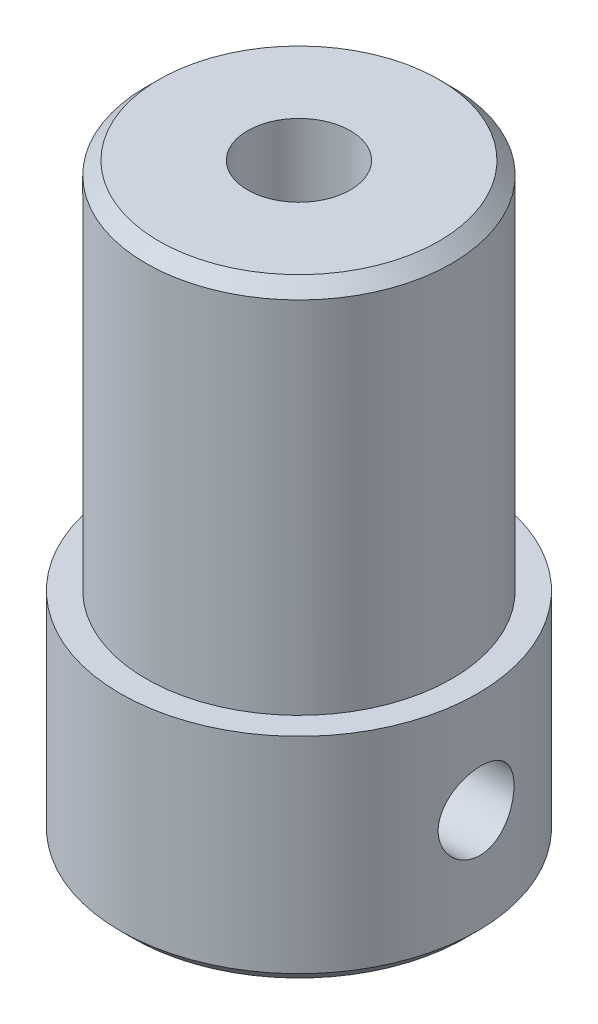
ISO-10303-21;
HEADER;
FILE_DESCRIPTION(('STEP AP214'),'2;1');
FILE_NAME('part.step','',(''),(''),'','','');
FILE_SCHEMA(('AUTOMOTIVE_DESIGN { 1 0 10303 214 1 1 1 1 }'));
ENDSEC;
DATA;
#1=APPLICATION_CONTEXT('core data for automotive mechanical design processes');
#2=APPLICATION_PROTOCOL_DEFINITION('international standard','automotive_design',2000,#1);
#3=PRODUCT_CONTEXT('',#1,'mechanical');
#4=PRODUCT('Part','Part','',(#3));
#5=PRODUCT_RELATED_PRODUCT_CATEGORY('part','',(#4));
#6=PRODUCT_DEFINITION_FORMATION('','',#4);
#7=PRODUCT_DEFINITION_CONTEXT('part definition',#1,'design');
#8=PRODUCT_DEFINITION('design','',#6,#7);
#9=PRODUCT_DEFINITION_SHAPE('','',#8);
#10=(LENGTH_UNIT() NAMED_UNIT(*) SI_UNIT(.MILLI.,.METRE.));
#11=(NAMED_UNIT(*) PLANE_ANGLE_UNIT() SI_UNIT($,.RADIAN.));
#12=(NAMED_UNIT(*) SI_UNIT($,.STERADIAN.) SOLID_ANGLE_UNIT());
#13=UNCERTAINTY_MEASURE_WITH_UNIT(LENGTH_MEASURE(1.E-05),#10,'distance_accuracy_value','');
#14=(GEOMETRIC_REPRESENTATION_CONTEXT(3) GLOBAL_UNCERTAINTY_ASSIGNED_CONTEXT((#13)) GLOBAL_UNIT_ASSIGNED_CONTEXT((#10,
#11,#12)) REPRESENTATION_CONTEXT('',''));
#15=CARTESIAN_POINT('',(0.,0.,0.));
#16=DIRECTION('',(0.,0.,1.));
#17=DIRECTION('',(1.,0.,0.));
#18=AXIS2_PLACEMENT_3D('',#15,#16,#17);
#19=CARTESIAN_POINT('',(0.,-8.49999999999988,0.));
#20=DIRECTION('',(0.,1.,0.));
#21=DIRECTION('',(-1.,0.,0.));
#22=AXIS2_PLACEMENT_3D('',#19,#20,#21);
#23=CONICAL_SURFACE('',#22,6.45000000000001,0.785398163397403);
#24=CARTESIAN_POINT('',(0.,-8.,0.));
#25=DIRECTION('',(0.,1.,0.));
#26=DIRECTION('',(-0.0158594986178011,0.,-0.99987423024278));
#27=AXIS2_PLACEMENT_3D('',#24,#25,#26);
#28=CIRCLE('',#27,6.94999999999968);
#29=CARTESIAN_POINT('',(-0.1102235153937,-8.,-6.949125900187));
#30=VERTEX_POINT('',#29);
#31=EDGE_CURVE('E31',#30,#30,#28,.F.);
#32=ORIENTED_EDGE('',*,*,#31,.T.);
#33=EDGE_LOOP('',(#32));
#34=FACE_BOUND('',#33,.T.);
#35=CARTESIAN_POINT('',(0.,-8.49999999999988,0.));
#36=DIRECTION('',(0.,1.,0.));
#37=DIRECTION('',(-1.,0.,0.));
#38=AXIS2_PLACEMENT_3D('',#35,#36,#37);
#39=CIRCLE('',#38,6.45000000000001);
#40=CARTESIAN_POINT('',(-6.45,-8.49999999999988,0.));
#41=VERTEX_POINT('',#40);
#42=EDGE_CURVE('E85',#41,#41,#39,.T.);
#43=ORIENTED_EDGE('',*,*,#42,.T.);
#44=EDGE_LOOP('',(#43));
#45=FACE_BOUND('',#44,.T.);
#46=ADVANCED_FACE('F15',(#34,#45),#23,.T.);
#47=CARTESIAN_POINT('',(0.,-8.,0.));
#48=DIRECTION('',(0.,1.,0.));
#49=DIRECTION('',(-1.,0.,0.));
#50=AXIS2_PLACEMENT_3D('',#47,#48,#49);
#51=CYLINDRICAL_SURFACE('',#50,6.94999999999968);
#52=CARTESIAN_POINT('',(0.,0.,0.));
#53=DIRECTION('',(0.,1.,0.));
#54=DIRECTION('',(-1.,0.,0.));
#55=AXIS2_PLACEMENT_3D('',#52,#53,#54);
#56=CIRCLE('',#55,6.94999999999968);
#57=CARTESIAN_POINT('',(-6.94999999999967,0.,0.));
#58=VERTEX_POINT('',#57);
#59=EDGE_CURVE('E19',#58,#58,#56,.F.);
#60=ORIENTED_EDGE('',*,*,#59,.T.);
#61=EDGE_LOOP('',(#60));
#62=FACE_BOUND('',#61,.T.);
#63=CARTESIAN_POINT('',(-0.11022351539376,-2.5,-6.949125900187));
#64=CARTESIAN_POINT('',(-0.193344863412011,-2.50000406894324,-6.94780537089057));
#65=CARTESIAN_POINT('',(-0.276543952114574,-2.50694091534223,-6.94497936210981));
#66=CARTESIAN_POINT('',(-0.440603748723627,-2.53449753954052,-6.93650828429143));
#67=CARTESIAN_POINT('',(-0.5214595719617,-2.55514401606639,-6.93085771991047));
#68=CARTESIAN_POINT('',(-0.678341484584678,-2.6094460870512,-6.91726408196757));
#69=CARTESIAN_POINT('',(-0.754374642144963,-2.64308210570557,-6.90932446265237));
#70=CARTESIAN_POINT('',(-0.899664608869432,-2.72235587911955,-6.89191295110932));
#71=CARTESIAN_POINT('',(-0.968923503806036,-2.76798992366668,-6.88244153291555));
#72=CARTESIAN_POINT('',(-1.09983136209104,-2.87073064908327,-6.8627486923427));
#73=CARTESIAN_POINT('',(-1.16135891042388,-2.92799038958982,-6.85251856048126));
#74=CARTESIAN_POINT('',(-1.27402119852419,-3.05203114867596,-6.83247043228073));
#75=CARTESIAN_POINT('',(-1.32515447142077,-3.11881350885629,-6.82265249426657));
#76=CARTESIAN_POINT('',(-1.41610998872586,-3.2608855619712,-6.80436000173828));
#77=CARTESIAN_POINT('',(-1.45580519793212,-3.33625872470874,-6.79590096463733));
#78=CARTESIAN_POINT('',(-1.5219541445234,-3.49282363248467,-6.78139439586882));
#79=CARTESIAN_POINT('',(-1.54840953022773,-3.57401465177744,-6.77534656403233));
#80=CARTESIAN_POINT('',(-1.58694123238496,-3.73860786093754,-6.76642494368967));
#81=CARTESIAN_POINT('',(-1.5992295182203,-3.82195784806193,-6.76350441279603));
#82=CARTESIAN_POINT('',(-1.60974090955197,-3.98958513793317,-6.76101069209348));
#83=CARTESIAN_POINT('',(-1.60796567640586,-4.07386232997248,-6.76143710690173));
#84=CARTESIAN_POINT('',(-1.59057056440413,-4.23937377755637,-6.7655494786414));
#85=CARTESIAN_POINT('',(-1.57519645919818,-4.32063549057909,-6.76917756870346));
#86=CARTESIAN_POINT('',(-1.5314244453998,-4.4793896866241,-6.77921372197776));
#87=CARTESIAN_POINT('',(-1.50302572831774,-4.55688193533037,-6.78562195776341));
#88=CARTESIAN_POINT('',(-1.43377461105617,-4.70659529231971,-6.80059178048607));
#89=CARTESIAN_POINT('',(-1.39282677185603,-4.77877055593394,-6.809169778484));
#90=CARTESIAN_POINT('',(-1.29969943955777,-4.91528974334028,-6.82755646379745));
#91=CARTESIAN_POINT('',(-1.24751925742982,-4.97963318632285,-6.83736522659683));
#92=CARTESIAN_POINT('',(-1.13210221140515,-5.10007797657099,-6.85742950832469));
#93=CARTESIAN_POINT('',(-1.06865739978778,-5.15597938180106,-6.8676900784514));
#94=CARTESIAN_POINT('',(-0.933146962914459,-5.25637871380692,-6.8874100406358));
#95=CARTESIAN_POINT('',(-0.861077600818949,-5.30087167110811,-6.89686908235381));
#96=CARTESIAN_POINT('',(-0.710092858549023,-5.37723624275188,-6.91404773829731));
#97=CARTESIAN_POINT('',(-0.631158824951641,-5.40907206941644,-6.92176239416666));
#98=CARTESIAN_POINT('',(-0.468951708838437,-5.4588921443798,-6.93463529603917));
#99=CARTESIAN_POINT('',(-0.385688108132887,-5.47690540435105,-6.93979888821173));
#100=CARTESIAN_POINT('',(-0.269836208689717,-5.49182321271992,-6.94483310706281));
#101=CARTESIAN_POINT('',(-0.238003628714997,-5.49488678240065,-6.945996908903));
#102=CARTESIAN_POINT('',(-0.174194733306444,-5.49897596086486,-6.94788996663874));
#103=CARTESIAN_POINT('',(-0.142218417630072,-5.50000156620821,-6.94861922180076));
#104=CARTESIAN_POINT('',(-0.0271021007557265,-5.49999593105676,-6.95044222939219));
#105=CARTESIAN_POINT('',(0.056144761753114,-5.49305908465776,-6.950256301987));
#106=CARTESIAN_POINT('',(0.220390688809527,-5.46550246045944,-6.94699264327515));
#107=CARTESIAN_POINT('',(0.301385045430761,-5.44485598393356,-6.94390926447227));
#108=CARTESIAN_POINT('',(0.458619161351971,-5.39055391294874,-6.93529797587876));
#109=CARTESIAN_POINT('',(0.534865875720237,-5.35691789429437,-6.92977374276447));
#110=CARTESIAN_POINT('',(0.680634960932658,-5.27764412088037,-6.91697886248591));
#111=CARTESIAN_POINT('',(0.750159401465996,-5.23201007633322,-6.90970875526754));
#112=CARTESIAN_POINT('',(0.881625965489407,-5.12926935091662,-6.89417756489238));
#113=CARTESIAN_POINT('',(0.943447011262735,-5.07200961041007,-6.88590392595631));
#114=CARTESIAN_POINT('',(1.05668845143789,-4.94796885132391,-6.86943896827661));
#115=CARTESIAN_POINT('',(1.10810737785697,-4.88118649114358,-6.86124766130675));
#116=CARTESIAN_POINT('',(1.19959728677208,-4.73911443802865,-6.84584902572311));
#117=CARTESIAN_POINT('',(1.23954080583569,-4.66374127529111,-6.83865317779407));
#118=CARTESIAN_POINT('',(1.30611655231559,-4.50717636751518,-6.82625182088386));
#119=CARTESIAN_POINT('',(1.33275043674184,-4.4259853482224,-6.82104606416122));
#120=CARTESIAN_POINT('',(1.37154570488679,-4.26139213906229,-6.81335096505647));
#121=CARTESIAN_POINT('',(1.38392043379247,-4.1780421519379,-6.81082162641117));
#122=CARTESIAN_POINT('',(1.39450562576801,-4.01041486206667,-6.80866252902793));
#123=CARTESIAN_POINT('',(1.39271776189926,-3.92613767002736,-6.80903242779599));
#124=CARTESIAN_POINT('',(1.37520097656086,-3.76062622244347,-6.81259104470244));
#125=CARTESIAN_POINT('',(1.3597195403533,-3.67936450942075,-6.8157297197945));
#126=CARTESIAN_POINT('',(1.31565124927149,-3.52061031337575,-6.82437259464268));
#127=CARTESIAN_POINT('',(1.28706358084115,-3.44311806466948,-6.82987694124414));
#128=CARTESIAN_POINT('',(1.21737253212697,-3.29340470768015,-6.84264293370236));
#129=CARTESIAN_POINT('',(1.17617324035592,-3.22122944406592,-6.84991795551519));
#130=CARTESIAN_POINT('',(1.08250962164855,-3.08471025665959,-6.86534185737079));
#131=CARTESIAN_POINT('',(1.03004460363506,-3.02036681367703,-6.87349079100686));
#132=CARTESIAN_POINT('',(0.914049279000054,-2.8999220234289,-6.88988452691845));
#133=CARTESIAN_POINT('',(0.850310969066665,-2.84402061819884,-6.89812778278759));
#134=CARTESIAN_POINT('',(0.714243281607942,-2.74362128619299,-6.91354011031434));
#135=CARTESIAN_POINT('',(0.641910180233891,-2.69912832889181,-6.92070871329463));
#136=CARTESIAN_POINT('',(0.490456569235176,-2.62276375724806,-6.93309024525937));
#137=CARTESIAN_POINT('',(0.411317572825407,-2.5909279305835,-6.93829762678851));
#138=CARTESIAN_POINT('',(0.248783790393891,-2.54110785562017,-6.94601965300502));
#139=CARTESIAN_POINT('',(0.165398311858813,-2.52309459564892,-6.94853994188809));
#140=CARTESIAN_POINT('',(0.0494450311208052,-2.50817678728007,-6.94989738437721));
#141=CARTESIAN_POINT('',(0.0175915544578941,-2.50511321759935,-6.95005103024311));
#142=CARTESIAN_POINT('',(-0.0462452803932069,-2.50102403913515,-6.94991943605624));
#143=CARTESIAN_POINT('',(-0.0782286388005489,-2.4999984337918,-6.94963419526263));
#144=CARTESIAN_POINT('',(-0.11022351539376,-2.5,-6.949125900187));
#145=B_SPLINE_CURVE_WITH_KNOTS('',3,(#63,#64,#65,#66,#67,#68,#69,#70,#71,#72,#73,#74,#75,#76,
#77,#78,#79,#80,#81,#82,#83,#84,#85,#86,#87,#88,#89,#90,#91,#92,#93,#94,#95,#96,#97,#98,#99,
#100,#101,#102,#103,#104,#105,#106,#107,#108,#109,#110,#111,#112,#113,#114,#115,#116,#117,#118,
#119,#120,#121,#122,#123,#124,#125,#126,#127,#128,#129,#130,#131,#132,#133,#134,#135,#136,#137,
#138,#139,#140,#141,#142,#143,#144),.UNSPECIFIED.,.T.,.F.,(4,2,2,2,2,2,2,2,2,2,2,2,2,2,2,2,2,2,
2,2,2,2,2,2,2,2,2,2,2,2,2,2,2,2,2,2,2,2,2,2,4),(0.,0.249273069524613,0.499033013530775,
0.74841801814209,0.997725994639765,1.25055822153284,1.50342610412463,1.75900279059798,
2.01454765060119,2.26621726816714,2.51785715583488,2.76503999115932,3.01223817218584,
3.26136507676066,3.51050726797799,3.76484687400898,4.01929708186854,4.27446170932818,
4.5290893051779,4.62503875528776,4.7209883673623,4.97026143688692,5.22002138089308,
5.4694063855044,5.71871436200208,5.97154658889515,6.22441447148694,6.47999115796029,
6.73553601796351,6.98720563552945,7.23884552319719,7.48602835852163,7.73322653954815,
7.98235344412297,8.2314956353403,8.48583524137129,8.74028544923085,8.99545007669049,
9.25007767254021,9.34602712264991,9.44197673472429),.UNSPECIFIED.);
#146=CARTESIAN_POINT('',(-0.11022351539376,-2.5,-6.949125900187));
#147=VERTEX_POINT('',#146);
#148=EDGE_CURVE('E80',#147,#147,#145,.T.);
#149=ORIENTED_EDGE('',*,*,#148,.T.);
#150=EDGE_LOOP('',(#149));
#151=FACE_BOUND('',#150,.T.);
#152=CARTESIAN_POINT('',(6.949125900239,-5.5,-0.110223512116245));
#153=CARTESIAN_POINT('',(6.95044222940513,-5.49999593087506,-0.0271020974672325));
#154=CARTESIAN_POINT('',(6.95025630196025,-5.49305908429256,0.0561447650356749));
#155=CARTESIAN_POINT('',(6.94699264317218,-5.46550245972996,0.220390692047466));
#156=CARTESIAN_POINT('',(6.94390926433283,-5.44485598302355,0.301385048629993));
#157=CARTESIAN_POINT('',(6.93529797567372,-5.39055391168642,0.45861916444393));
#158=CARTESIAN_POINT('',(6.92977374253028,-5.35691789286021,0.534865878743657));
#159=CARTESIAN_POINT('',(6.91697886220372,-5.27764411911527,0.680634963791934));
#160=CARTESIAN_POINT('',(6.90970875496651,-5.23201007440894,0.750159404229645));
#161=CARTESIAN_POINT('',(6.89417756456553,-5.1292693486865,0.881625968037441));
#162=CARTESIAN_POINT('',(6.88590392562265,-5.07200960803317,0.943447013690155));
#163=CARTESIAN_POINT('',(6.86943896794291,-4.94796884867323,1.05668845360024));
#164=CARTESIAN_POINT('',(6.86124766097982,-4.8811864883659,1.10810737987487));
#165=CARTESIAN_POINT('',(6.84584902542428,-4.7391144350306,1.19959728847111));
#166=CARTESIAN_POINT('',(6.83865317751654,-4.66374127220117,1.23954080736195));
#167=CARTESIAN_POINT('',(6.8262518206597,-4.50717636427171,1.3061165534825));
#168=CARTESIAN_POINT('',(6.82104606396911,-4.4259853449173,1.33275043772221));
#169=CARTESIAN_POINT('',(6.81335096493533,-4.26139213567932,1.37154570548585));
#170=CARTESIAN_POINT('',(6.81082162632847,-4.17804214853866,1.38392043419879));
#171=CARTESIAN_POINT('',(6.80866252902309,-4.01041485866874,1.39450562579092));
#172=CARTESIAN_POINT('',(6.80903242783057,-3.92613766664702,1.39271776173149));
#173=CARTESIAN_POINT('',(6.81259104481136,-3.7606262191211,1.37520097602254));
#174=CARTESIAN_POINT('',(6.8157297199387,-3.67936450613837,1.35971953963347));
#175=CARTESIAN_POINT('',(6.82437259484999,-3.52061031020257,1.31565124819926));
#176=CARTESIAN_POINT('',(6.82987694147927,-3.44311806156553,1.28706357959801));
#177=CARTESIAN_POINT('',(6.84264293398396,-3.29340470472771,1.21737253054925));
#178=CARTESIAN_POINT('',(6.84991795581567,-3.22122944119705,1.17617323861241));
#179=CARTESIAN_POINT('',(6.8653418576968,-3.08471025398399,1.08250961958799));
#180=CARTESIAN_POINT('',(6.87349079133952,-3.02036681111112,1.03004460142324));
#181=CARTESIAN_POINT('',(6.88988452725102,-2.89992202111037,0.914049276502441));
#182=CARTESIAN_POINT('',(6.89812778311316,-2.84402061601822,0.850310966435201));
#183=CARTESIAN_POINT('',(6.91354011061271,-2.7436212843096,0.714243278731518));
#184=CARTESIAN_POINT('',(6.92070871357278,-2.69912832716779,0.641910177246337));
#185=CARTESIAN_POINT('',(6.93309024548445,-2.62276375586868,0.490456566066297));
#186=CARTESIAN_POINT('',(6.93829762698106,-2.59092792938714,0.411317569587606));
#187=CARTESIAN_POINT('',(6.9460196531253,-2.54110785479895,0.248783787052097));
#188=CARTESIAN_POINT('',(6.94853994196869,-2.52309459501956,0.165398308481965));
#189=CARTESIAN_POINT('',(6.94989738439484,-2.50817678698876,0.0494450282836722));
#190=CARTESIAN_POINT('',(6.95005103024627,-2.50511321741714,0.0175915521839049));
#191=CARTESIAN_POINT('',(6.94991943604606,-2.50102403909862,-0.046245281533845));
#192=CARTESIAN_POINT('',(6.94963419525357,-2.49999843379184,-0.0782286393709794));
#193=CARTESIAN_POINT('',(6.94780537089062,-2.5000040689432,-0.193344863410474));
#194=CARTESIAN_POINT('',(6.94497936210989,-2.50694091534207,-0.276543952112693));
#195=CARTESIAN_POINT('',(6.93650828429155,-2.53449753954011,-0.440603748722163));
#196=CARTESIAN_POINT('',(6.93085771991055,-2.55514401606611,-0.521459571960944));
#197=CARTESIAN_POINT('',(6.91726408196756,-2.60944608705125,-0.678341484584818));
#198=CARTESIAN_POINT('',(6.90932446265234,-2.64308210570572,-0.754374642145325));
#199=CARTESIAN_POINT('',(6.89191295110929,-2.72235587911976,-0.899664608869786));
#200=CARTESIAN_POINT('',(6.88244153291554,-2.76798992366679,-0.968923503806196));
#201=CARTESIAN_POINT('',(6.86274869234272,-2.87073064908322,-1.09983136209099));
#202=CARTESIAN_POINT('',(6.85251856048128,-2.92799038958973,-1.16135891042381));
#203=CARTESIAN_POINT('',(6.83247043228075,-3.05203114867586,-1.27402119852413));
#204=CARTESIAN_POINT('',(6.82265249426658,-3.11881350885622,-1.32515447142074));
#205=CARTESIAN_POINT('',(6.80436000173829,-3.26088556197118,-1.41610998872587));
#206=CARTESIAN_POINT('',(6.79590096463734,-3.33625872470872,-1.45580519793213));
#207=CARTESIAN_POINT('',(6.78139439586883,-3.49282363248465,-1.52195414452341));
#208=CARTESIAN_POINT('',(6.77534656403234,-3.57401465177741,-1.54840953022774));
#209=CARTESIAN_POINT('',(6.76642494368968,-3.73860786093751,-1.58694123238497));
#210=CARTESIAN_POINT('',(6.76350441279603,-3.82195784806189,-1.59922951822031));
#211=CARTESIAN_POINT('',(6.76101069209349,-3.98958513793313,-1.60974090955199));
#212=CARTESIAN_POINT('',(6.76143710690174,-4.07386232997244,-1.60796567640588));
#213=CARTESIAN_POINT('',(6.7655494786414,-4.23937377755635,-1.59057056440416));
#214=CARTESIAN_POINT('',(6.76917756870346,-4.32063549057907,-1.5751964591982));
#215=CARTESIAN_POINT('',(6.77921372197777,-4.47938968662408,-1.53142444539983));
#216=CARTESIAN_POINT('',(6.78562195776342,-4.55688193533034,-1.50302572831777));
#217=CARTESIAN_POINT('',(6.80059178048607,-4.70659529231964,-1.43377461105623));
#218=CARTESIAN_POINT('',(6.809169778484,-4.77877055593383,-1.39282677185611));
#219=CARTESIAN_POINT('',(6.82755646379744,-4.91528974334018,-1.29969943955787));
#220=CARTESIAN_POINT('',(6.83736522659683,-4.97963318632279,-1.24751925742989));
#221=CARTESIAN_POINT('',(6.85742950832473,-5.10007797657111,-1.13210221140505));
#222=CARTESIAN_POINT('',(6.86769007845146,-5.15597938180131,-1.06865739978751));
#223=CARTESIAN_POINT('',(6.88741004063585,-5.25637871380711,-0.933146962914168));
#224=CARTESIAN_POINT('',(6.89686908235384,-5.30087167110817,-0.861077600818862));
#225=CARTESIAN_POINT('',(6.91404773829724,-5.37723624275149,-0.710092858549768));
#226=CARTESIAN_POINT('',(6.92176239416652,-5.40907206941583,-0.631158824953064));
#227=CARTESIAN_POINT('',(6.93463529603906,-5.4588921443794,-0.468951708840306));
#228=CARTESIAN_POINT('',(6.93979888821166,-5.47690540435082,-0.385688108134435));
#229=CARTESIAN_POINT('',(6.94483310708636,-5.49182321278966,-0.269836208148189));
#230=CARTESIAN_POINT('',(6.94599690894279,-5.49488678250537,-0.238003627627452));
#231=CARTESIAN_POINT('',(6.94788996669598,-5.49897596096968,-0.17419473112429));
#232=CARTESIAN_POINT('',(6.9486192218592,-5.50000156627816,-0.142218414899326));
#233=CARTESIAN_POINT('',(6.949125900239,-5.5,-0.110223512116245));
#234=B_SPLINE_CURVE_WITH_KNOTS('',3,(#152,#153,#154,#155,#156,#157,#158,#159,#160,#161,#162,
#163,#164,#165,#166,#167,#168,#169,#170,#171,#172,#173,#174,#175,#176,#177,#178,#179,#180,#181,
#182,#183,#184,#185,#186,#187,#188,#189,#190,#191,#192,#193,#194,#195,#196,#197,#198,#199,#200,
#201,#202,#203,#204,#205,#206,#207,#208,#209,#210,#211,#212,#213,#214,#215,#216,#217,#218,#219,
#220,#221,#222,#223,#224,#225,#226,#227,#228,#229,#230,#231,#232,#233),.UNSPECIFIED.,.T.,.F.,(4,
2,2,2,2,2,2,2,2,2,2,2,2,2,2,2,2,2,2,2,2,2,2,2,2,2,2,2,2,2,2,2,2,2,2,2,2,2,2,2,4),(0.,
0.249273069553921,0.499033013584963,0.748418018222066,0.997725994746672,1.25055822167492,
1.50342610430136,1.75900279076993,2.01454765076814,2.26621726829439,2.51785715592268,
2.76503999123562,3.01223817225094,3.26136507685925,3.51050726810981,3.76484687416727,
4.01929708205421,4.27446170949515,4.52908930532115,4.62503875372093,4.7209883640854,
4.97026143360749,5.22002137761617,5.46940638222811,5.71871435872516,5.97154658561809,
6.22441446821002,6.4799911546834,6.73553601468659,6.98720563225253,7.23884551992027,
7.48602835524473,7.73322653627123,7.98235344084592,8.23149563206338,8.485835238095,
8.74028544595393,8.99545007341107,9.2500776692633,9.34602712101126,9.44197673472387),.UNSPECIFIED.);
#235=CARTESIAN_POINT('',(6.949125900239,-5.5,-0.110223512116245));
#236=VERTEX_POINT('',#235);
#237=EDGE_CURVE('E87',#236,#236,#234,.T.);
#238=ORIENTED_EDGE('',*,*,#237,.T.);
#239=EDGE_LOOP('',(#238));
#240=FACE_BOUND('',#239,.T.);
#241=ORIENTED_EDGE('',*,*,#31,.F.);
#242=EDGE_LOOP('',(#241));
#243=FACE_BOUND('',#242,.T.);
#244=ADVANCED_FACE('F76',(#62,#151,#240,#243),#51,.T.);
#245=CARTESIAN_POINT('',(7.347675830225,0.,7.112364065628));
#246=DIRECTION('',(0.,1.,0.));
#247=DIRECTION('',(-0.0158594986178065,0.,-0.99987423024278));
#248=AXIS2_PLACEMENT_3D('',#245,#246,#247);
#249=PLANE('',#248);
#250=CARTESIAN_POINT('',(0.,0.,0.));
#251=DIRECTION('',(0.,1.,0.));
#252=DIRECTION('',(-1.,0.,0.));
#253=AXIS2_PLACEMENT_3D('',#250,#251,#252);
#254=CIRCLE('',#253,5.95000000000046);
#255=CARTESIAN_POINT('',(-5.95000000000045,0.,0.));
#256=VERTEX_POINT('',#255);
#257=EDGE_CURVE('E67',#256,#256,#254,.F.);
#258=ORIENTED_EDGE('',*,*,#257,.T.);
#259=EDGE_LOOP('',(#258));
#260=FACE_BOUND('',#259,.T.);
#261=ORIENTED_EDGE('',*,*,#59,.F.);
#262=EDGE_LOOP('',(#261));
#263=FACE_BOUND('',#262,.T.);
#264=ADVANCED_FACE('F74',(#260,#263),#249,.T.);
#265=CARTESIAN_POINT('',(-0.0407887025117825,-4.,-2.57155497215976));
#266=DIRECTION('',(-0.0158594986178224,0.,-0.99987423024278));
#267=DIRECTION('',(-0.99987423024278,0.,0.0158594986178224));
#268=AXIS2_PLACEMENT_3D('',#265,#266,#267);
#269=CYLINDRICAL_SURFACE('',#268,1.5);
#270=ORIENTED_EDGE('',*,*,#148,.F.);
#271=EDGE_LOOP('',(#270));
#272=FACE_BOUND('',#271,.T.);
#273=CARTESIAN_POINT('',(-0.0475784958534101,-2.5,-2.99962269072801));
#274=CARTESIAN_POINT('',(-0.126490396656045,-2.50000399837244,-2.99836751064046));
#275=CARTESIAN_POINT('',(-0.205396774560173,-2.50626048322756,-2.99397378889478));
#276=CARTESIAN_POINT('',(-0.360735790226982,-2.53099600982361,-2.97925766114288));
#277=CARTESIAN_POINT('',(-0.437165845199994,-2.5494874076762,-2.96892926306045));
#278=CARTESIAN_POINT('',(-0.585148409255485,-2.59778825665002,-2.94333541395925));
#279=CARTESIAN_POINT('',(-0.656717131598789,-2.62755766206366,-2.92808745929435));
#280=CARTESIAN_POINT('',(-0.793692063930682,-2.69734803399556,-2.89396657406898));
#281=CARTESIAN_POINT('',(-0.859097542985599,-2.7373702143603,-2.87509321435581));
#282=CARTESIAN_POINT('',(-0.986333925184387,-2.82927677511684,-2.83405717096601));
#283=CARTESIAN_POINT('',(-1.04771016178455,-2.88173171845194,-2.81176465174744));
#284=CARTESIAN_POINT('',(-1.16119771159273,-2.99578456512334,-2.76683069281136));
#285=CARTESIAN_POINT('',(-1.21330232052947,-3.05738902585496,-2.74418901336964));
#286=CARTESIAN_POINT('',(-1.31084810843581,-3.19372488213179,-2.69903437665053));
#287=CARTESIAN_POINT('',(-1.35545891057981,-3.26910384761736,-2.67666763570297));
#288=CARTESIAN_POINT('',(-1.43125248840662,-3.42755067520386,-2.63692244671894));
#289=CARTESIAN_POINT('',(-1.46244480364915,-3.51061302376909,-2.61954045782996));
#290=CARTESIAN_POINT('',(-1.50851632094408,-3.67699755460624,-2.59326986376322));
#291=CARTESIAN_POINT('',(-1.52426036596701,-3.76000646422329,-2.58393507258933));
#292=CARTESIAN_POINT('',(-1.54165041892752,-3.92796803773667,-2.57360223071127));
#293=CARTESIAN_POINT('',(-1.54331032244951,-4.01291870285828,-2.57259596300912));
#294=CARTESIAN_POINT('',(-1.53312022105468,-4.17142909280502,-2.5786737570504));
#295=CARTESIAN_POINT('',(-1.52286206338757,-4.24513615845644,-2.58480472550279));
#296=CARTESIAN_POINT('',(-1.49187663976436,-4.38958297144546,-2.60281038769386));
#297=CARTESIAN_POINT('',(-1.47114605474483,-4.46032177033686,-2.61468690233823));
#298=CARTESIAN_POINT('',(-1.41941169219567,-4.59884444525574,-2.64313356383173));
#299=CARTESIAN_POINT('',(-1.3881797607429,-4.66652103933378,-2.65980664378266));
#300=CARTESIAN_POINT('',(-1.31648458558036,-4.79595276552001,-2.69601175978509));
#301=CARTESIAN_POINT('',(-1.27601739173012,-4.85770534768807,-2.71554501791754));
#302=CARTESIAN_POINT('',(-1.18099798208051,-4.98177571339385,-2.75831220084567));
#303=CARTESIAN_POINT('',(-1.12531079517057,-5.04317374445976,-2.78170143021936));
#304=CARTESIAN_POINT('',(-1.00431621865948,-5.15609353675065,-2.82763799551998));
#305=CARTESIAN_POINT('',(-0.939002471719303,-5.20760871924094,-2.85018476265908));
#306=CARTESIAN_POINT('',(-0.79672258748044,-5.30155510122915,-2.89326974947318));
#307=CARTESIAN_POINT('',(-0.719353482674491,-5.3434466080834,-2.91366407327177));
#308=CARTESIAN_POINT('',(-0.557432041091997,-5.41317794944935,-2.94891376279891));
#309=CARTESIAN_POINT('',(-0.472893723573588,-5.44104450147164,-2.96377964597538));
#310=CARTESIAN_POINT('',(-0.330966475720255,-5.47403831650542,-2.98221039376218));
#311=CARTESIAN_POINT('',(-0.274881963072138,-5.48374945615665,-2.98791895879868));
#312=CARTESIAN_POINT('',(-0.161740813179917,-5.49673142554489,-2.99617333258765));
#313=CARTESIAN_POINT('',(-0.104684272832808,-5.50000289347791,-2.99871945474103));
#314=CARTESIAN_POINT('',(0.0313335165697421,-5.49999600162756,-3.00087083361644));
#315=CARTESIAN_POINT('',(0.110339547746262,-5.49373951677244,-2.99898183852317));
#316=CARTESIAN_POINT('',(0.266067142634811,-5.46900399017638,-2.98919969179702));
#317=CARTESIAN_POINT('',(0.342786314895179,-5.45051259232379,-2.98130046918903));
#318=CARTESIAN_POINT('',(0.491506145835229,-5.40221174334997,-2.96041276320163));
#319=CARTESIAN_POINT('',(0.563522454722695,-5.37244233793633,-2.9474422815783));
#320=CARTESIAN_POINT('',(0.701510626318011,-5.30265196600443,-2.91768272184246));
#321=CARTESIAN_POINT('',(0.767481772070465,-5.26262978563968,-2.90089319161156));
#322=CARTESIAN_POINT('',(0.895955606781057,-5.17072322488314,-2.86391309416874));
#323=CARTESIAN_POINT('',(0.958007975649544,-5.11826828154804,-2.84357833697525));
#324=CARTESIAN_POINT('',(1.07286351670634,-5.00421543487663,-2.80226624049388));
#325=CARTESIAN_POINT('',(1.12565999559879,-4.94261097414501,-2.78128844897638));
#326=CARTESIAN_POINT('',(1.22458879301314,-4.80627511786817,-2.73925019261799));
#327=CARTESIAN_POINT('',(1.26988651517628,-4.7308961523826,-2.71830953514558));
#328=CARTESIAN_POINT('',(1.34690248422578,-4.5724493247961,-2.68098813379821));
#329=CARTESIAN_POINT('',(1.37863037817116,-4.48938697623086,-2.66460415339916));
#330=CARTESIAN_POINT('',(1.42551189140897,-4.32300244539371,-2.63980793322333));
#331=CARTESIAN_POINT('',(1.44154406940735,-4.23999353577666,-2.6309771604048));
#332=CARTESIAN_POINT('',(1.45925308050931,-4.07203196226329,-2.62120104210371));
#333=CARTESIAN_POINT('',(1.46094406280933,-3.98708129714168,-2.6202479244553));
#334=CARTESIAN_POINT('',(1.45056633023212,-3.82857090719494,-2.62599948193143));
#335=CARTESIAN_POINT('',(1.4401188891913,-3.75486384154352,-2.63180202866422));
#336=CARTESIAN_POINT('',(1.40857800298521,-3.61041702855451,-2.64881593019747));
#337=CARTESIAN_POINT('',(1.38748118267612,-3.53967822966311,-2.66002899972351));
#338=CARTESIAN_POINT('',(1.33487065886789,-3.40115555474424,-2.68682059547884));
#339=CARTESIAN_POINT('',(1.30312565169369,-3.33347896066619,-2.70249476712621));
#340=CARTESIAN_POINT('',(1.23031829706042,-3.20404723447996,-2.73640785718953));
#341=CARTESIAN_POINT('',(1.18925196268967,-3.14229465231191,-2.75464787179293));
#342=CARTESIAN_POINT('',(1.09292399076,-3.01822428660613,-2.79437999946922));
#343=CARTESIAN_POINT('',(1.03652302754884,-2.95682625554022,-2.81599134337677));
#344=CARTESIAN_POINT('',(0.914132438510523,-2.84390646324933,-2.85806745645262));
#345=CARTESIAN_POINT('',(0.848136476581507,-2.79239128075904,-2.87853145549617));
#346=CARTESIAN_POINT('',(0.704561725168336,-2.69844489877083,-2.91708236086092));
#347=CARTESIAN_POINT('',(0.626584734547536,-2.65655339191658,-2.93501266357448));
#348=CARTESIAN_POINT('',(0.463626802940655,-2.58682205055064,-2.96510928103095));
#349=CARTESIAN_POINT('',(0.378659540599413,-2.55895549852835,-2.97728655255189));
#350=CARTESIAN_POINT('',(0.2362191575656,-2.52596168349458,-2.99120680500577));
#351=CARTESIAN_POINT('',(0.179981810899871,-2.51625054384335,-2.99513377759929));
#352=CARTESIAN_POINT('',(0.0666357888378434,-2.50326857445511,-2.9997957265793));
#353=CARTESIAN_POINT('',(0.00952720035028601,-2.49999710652209,-3.00053101928215));
#354=CARTESIAN_POINT('',(-0.0475784958534101,-2.5,-2.99962269072801));
#355=B_SPLINE_CURVE_WITH_KNOTS('',3,(#273,#274,#275,#276,#277,#278,#279,#280,#281,#282,#283,
#284,#285,#286,#287,#288,#289,#290,#291,#292,#293,#294,#295,#296,#297,#298,#299,#300,#301,#302,
#303,#304,#305,#306,#307,#308,#309,#310,#311,#312,#313,#314,#315,#316,#317,#318,#319,#320,#321,
#322,#323,#324,#325,#326,#327,#328,#329,#330,#331,#332,#333,#334,#335,#336,#337,#338,#339,#340,
#341,#342,#343,#344,#345,#346,#347,#348,#349,#350,#351,#352,#353,#354),.UNSPECIFIED.,.T.,.F.,(4,
2,2,2,2,2,2,2,2,2,2,2,2,2,2,2,2,2,2,2,2,2,2,2,2,2,2,2,2,2,2,2,2,2,2,2,2,2,2,2,4),(0.,
0.236541480428305,0.473322210873984,0.709269947937177,0.945245632244078,1.19547738368132,
1.44588934770067,1.71572535454867,1.98536920948833,2.2388698481445,2.49212035088586,
2.7150858455335,2.9381220497993,3.16635602724592,3.39468780934252,3.65195007713053,
3.90938300743742,4.17889584105611,4.4478932912926,4.61908679524577,4.79026333241598,
5.02680481284429,5.26358554328997,5.49953328035316,5.73550896466007,5.98574071609731,
6.23615268011667,6.50598868696467,6.77563254190434,7.0291331805605,7.28238368330186,
7.50534917794949,7.72838538221529,7.95661935966191,8.18495114175851,8.44221340954652,
8.69964633985341,8.9691591734721,9.23815662370859,9.40935012766174,9.58052666483191),.UNSPECIFIED.);
#356=CARTESIAN_POINT('',(-0.0475784958534101,-2.5,-2.99962269072801));
#357=VERTEX_POINT('',#356);
#358=EDGE_CURVE('E62',#357,#357,#355,.T.);
#359=ORIENTED_EDGE('',*,*,#358,.T.);
#360=EDGE_LOOP('',(#359));
#361=FACE_BOUND('',#360,.T.);
#362=ADVANCED_FACE('F69',(#272,#361),#269,.F.);
#363=CARTESIAN_POINT('',(6.819066132496,-8.5,6.60068319642));
#364=DIRECTION('',(0.,1.,0.));
#365=DIRECTION('',(-0.01585949861777,0.,-0.999874230242781));
#366=AXIS2_PLACEMENT_3D('',#363,#364,#365);
#367=PLANE('',#366);
#368=CARTESIAN_POINT('',(0.,-8.5,0.));
#369=DIRECTION('',(0.,-1.,0.));
#370=DIRECTION('',(1.,0.,0.));
#371=AXIS2_PLACEMENT_3D('',#368,#369,#370);
#372=CIRCLE('',#371,2.99999999999967);
#373=CARTESIAN_POINT('',(2.99999999999968,-8.5,0.));
#374=VERTEX_POINT('',#373);
#375=EDGE_CURVE('E47',#374,#374,#372,.F.);
#376=ORIENTED_EDGE('',*,*,#375,.T.);
#377=EDGE_LOOP('',(#376));
#378=FACE_BOUND('',#377,.T.);
#379=ORIENTED_EDGE('',*,*,#42,.F.);
#380=EDGE_LOOP('',(#379));
#381=FACE_BOUND('',#380,.T.);
#382=ADVANCED_FACE('F73',(#378,#381),#367,.F.);
#383=CARTESIAN_POINT('',(2.57156299298799,-4.,-0.0407888297341175));
#384=DIRECTION('',(0.99987423024278,0.,-0.0158594986178222));
#385=DIRECTION('',(-0.0158594986178222,0.,-0.99987423024278));
#386=AXIS2_PLACEMENT_3D('',#383,#384,#385);
#387=CYLINDRICAL_SURFACE('',#386,1.5);
#388=ORIENTED_EDGE('',*,*,#237,.F.);
#389=EDGE_LOOP('',(#388));
#390=FACE_BOUND('',#389,.T.);
#391=CARTESIAN_POINT('',(2.99962269072802,-5.5,-0.0475784958534308));
#392=CARTESIAN_POINT('',(3.00087083361645,-5.49999600162756,0.0313335165696925));
#393=CARTESIAN_POINT('',(2.99898183852318,-5.49373951677244,0.110339547746212));
#394=CARTESIAN_POINT('',(2.98919969179703,-5.46900399017639,0.266067142634761));
#395=CARTESIAN_POINT('',(2.98130046918904,-5.4505125923238,0.34278631489513));
#396=CARTESIAN_POINT('',(2.96041276320165,-5.40221174334998,0.491506145835179));
#397=CARTESIAN_POINT('',(2.94744228157832,-5.37244233793634,0.563522454722645));
#398=CARTESIAN_POINT('',(2.91768272184248,-5.30265196600444,0.701510626317962));
#399=CARTESIAN_POINT('',(2.90089319161158,-5.2626297856397,0.767481772070417));
#400=CARTESIAN_POINT('',(2.86391309416876,-5.17072322488316,0.89595560678101));
#401=CARTESIAN_POINT('',(2.84357833697527,-5.11826828154806,0.958007975649499));
#402=CARTESIAN_POINT('',(2.80226624049391,-5.00421543487665,1.07286351670629));
#403=CARTESIAN_POINT('',(2.7812884489764,-4.94261097414504,1.12565999559874));
#404=CARTESIAN_POINT('',(2.73925019261801,-4.8062751178682,1.2245887930131));
#405=CARTESIAN_POINT('',(2.71830953514561,-4.73089615238263,1.26988651517624));
#406=CARTESIAN_POINT('',(2.68098813379823,-4.57244932479614,1.34690248422575));
#407=CARTESIAN_POINT('',(2.66460415339918,-4.4893869762309,1.37863037817113));
#408=CARTESIAN_POINT('',(2.63980793322335,-4.32300244539375,1.42551189140895));
#409=CARTESIAN_POINT('',(2.63097716040482,-4.2399935357767,1.44154406940732));
#410=CARTESIAN_POINT('',(2.62120104210372,-4.07203196226332,1.45925308050929));
#411=CARTESIAN_POINT('',(2.62024792445531,-3.98708129714171,1.46094406280931));
#412=CARTESIAN_POINT('',(2.62599948193144,-3.82857090719497,1.45056633023211));
#413=CARTESIAN_POINT('',(2.63180202866423,-3.75486384154356,1.44011888919129));
#414=CARTESIAN_POINT('',(2.64881593019749,-3.61041702855454,1.4085780029852));
#415=CARTESIAN_POINT('',(2.66002899972352,-3.53967822966314,1.38748118267611));
#416=CARTESIAN_POINT('',(2.68682059547885,-3.40115555474427,1.33487065886788));
#417=CARTESIAN_POINT('',(2.70249476712622,-3.33347896066622,1.30312565169369));
#418=CARTESIAN_POINT('',(2.73640785718953,-3.20404723447999,1.23031829706042));
#419=CARTESIAN_POINT('',(2.75464787179294,-3.14229465231194,1.18925196268967));
#420=CARTESIAN_POINT('',(2.79437999946923,-3.01822428660616,1.09292399076));
#421=CARTESIAN_POINT('',(2.81599134337678,-2.95682625554025,1.03652302754884));
#422=CARTESIAN_POINT('',(2.85806745645262,-2.84390646324935,0.914132438510527));
#423=CARTESIAN_POINT('',(2.87853145549617,-2.79239128075906,0.848136476581514));
#424=CARTESIAN_POINT('',(2.91708236086093,-2.69844489877085,0.704561725168346));
#425=CARTESIAN_POINT('',(2.93501266357449,-2.6565533919166,0.626584734547547));
#426=CARTESIAN_POINT('',(2.96510928103095,-2.58682205055065,0.463626802940668));
#427=CARTESIAN_POINT('',(2.97728655255189,-2.55895549852836,0.378659540599427));
#428=CARTESIAN_POINT('',(2.99120680500578,-2.52596168349459,0.236219157565609));
#429=CARTESIAN_POINT('',(2.9951337775993,-2.51625054384336,0.179981810899874));
#430=CARTESIAN_POINT('',(2.99979572657931,-2.50326857445511,0.0666357888378355));
#431=CARTESIAN_POINT('',(3.00053101928216,-2.49999710652209,0.00952720035027224));
#432=CARTESIAN_POINT('',(2.99836751064046,-2.50000399837244,-0.126490396656064));
#433=CARTESIAN_POINT('',(2.99397378889478,-2.50626048322756,-0.205396774560192));
#434=CARTESIAN_POINT('',(2.97925766114289,-2.53099600982362,-0.360735790227002));
#435=CARTESIAN_POINT('',(2.96892926306046,-2.5494874076762,-0.437165845200014));
#436=CARTESIAN_POINT('',(2.94333541395926,-2.59778825665002,-0.585148409255504));
#437=CARTESIAN_POINT('',(2.92808745929435,-2.62755766206366,-0.656717131598809));
#438=CARTESIAN_POINT('',(2.89396657406898,-2.69734803399556,-0.793692063930701));
#439=CARTESIAN_POINT('',(2.87509321435581,-2.7373702143603,-0.859097542985618));
#440=CARTESIAN_POINT('',(2.83405717096602,-2.82927677511684,-0.986333925184407));
#441=CARTESIAN_POINT('',(2.81176465174745,-2.88173171845194,-1.04771016178456));
#442=CARTESIAN_POINT('',(2.76683069281136,-2.99578456512334,-1.16119771159274));
#443=CARTESIAN_POINT('',(2.74418901336964,-3.05738902585496,-1.21330232052949));
#444=CARTESIAN_POINT('',(2.69903437665053,-3.19372488213179,-1.31084810843583));
#445=CARTESIAN_POINT('',(2.67666763570297,-3.26910384761736,-1.35545891057983));
#446=CARTESIAN_POINT('',(2.63692244671894,-3.42755067520386,-1.43125248840664));
#447=CARTESIAN_POINT('',(2.61954045782996,-3.51061302376909,-1.46244480364917));
#448=CARTESIAN_POINT('',(2.59326986376322,-3.67699755460624,-1.5085163209441));
#449=CARTESIAN_POINT('',(2.58393507258934,-3.76000646422329,-1.52426036596703));
#450=CARTESIAN_POINT('',(2.57360223071127,-3.92796803773667,-1.54165041892754));
#451=CARTESIAN_POINT('',(2.57259596300913,-4.01291870285828,-1.54331032244953));
#452=CARTESIAN_POINT('',(2.5786737570504,-4.17142909280502,-1.5331202210547));
#453=CARTESIAN_POINT('',(2.5848047255028,-4.24513615845644,-1.52286206338759));
#454=CARTESIAN_POINT('',(2.60281038769386,-4.38958297144546,-1.49187663976438));
#455=CARTESIAN_POINT('',(2.61468690233823,-4.46032177033686,-1.47114605474485));
#456=CARTESIAN_POINT('',(2.64313356383174,-4.59884444525574,-1.41941169219569));
#457=CARTESIAN_POINT('',(2.65980664378267,-4.66652103933378,-1.38817976074292));
#458=CARTESIAN_POINT('',(2.69601175978509,-4.79595276552001,-1.31648458558038));
#459=CARTESIAN_POINT('',(2.71554501791755,-4.85770534768807,-1.27601739173014));
#460=CARTESIAN_POINT('',(2.75831220084568,-4.98177571339385,-1.18099798208053));
#461=CARTESIAN_POINT('',(2.78170143021937,-5.04317374445976,-1.12531079517059));
#462=CARTESIAN_POINT('',(2.82763799551998,-5.15609353675065,-1.0043162186595));
#463=CARTESIAN_POINT('',(2.85018476265908,-5.20760871924094,-0.939002471719324));
#464=CARTESIAN_POINT('',(2.89326974947318,-5.30155510122915,-0.796722587480462));
#465=CARTESIAN_POINT('',(2.91366407327178,-5.3434466080834,-0.719353482674512));
#466=CARTESIAN_POINT('',(2.94891376279892,-5.41317794944935,-0.557432041092018));
#467=CARTESIAN_POINT('',(2.96377964597539,-5.44104450147164,-0.472893723573609));
#468=CARTESIAN_POINT('',(2.98221039376218,-5.47403831650541,-0.330966475720281));
#469=CARTESIAN_POINT('',(2.98791895879868,-5.48374945615665,-0.274881963072169));
#470=CARTESIAN_POINT('',(2.99617333258766,-5.49673142554489,-0.161740813179957));
#471=CARTESIAN_POINT('',(2.99871945474104,-5.50000289347791,-0.104684272832853));
#472=CARTESIAN_POINT('',(2.99962269072802,-5.5,-0.0475784958534308));
#473=B_SPLINE_CURVE_WITH_KNOTS('',3,(#391,#392,#393,#394,#395,#396,#397,#398,#399,#400,#401,
#402,#403,#404,#405,#406,#407,#408,#409,#410,#411,#412,#413,#414,#415,#416,#417,#418,#419,#420,
#421,#422,#423,#424,#425,#426,#427,#428,#429,#430,#431,#432,#433,#434,#435,#436,#437,#438,#439,
#440,#441,#442,#443,#444,#445,#446,#447,#448,#449,#450,#451,#452,#453,#454,#455,#456,#457,#458,
#459,#460,#461,#462,#463,#464,#465,#466,#467,#468,#469,#470,#471,#472),.UNSPECIFIED.,.T.,.F.,(4,
2,2,2,2,2,2,2,2,2,2,2,2,2,2,2,2,2,2,2,2,2,2,2,2,2,2,2,2,2,2,2,2,2,2,2,2,2,2,2,4),(0.,
0.236541480428307,0.473322210873986,0.709269947937181,0.945245632244084,1.19547738368133,
1.44588934770069,1.71572535454868,1.98536920948835,2.23886984814451,2.49212035088587,
2.71508584553351,2.93812204979931,3.16635602724592,3.39468780934252,3.65195007713054,
3.90938300743742,4.17889584105611,4.4478932912926,4.61908679524577,4.79026333241596,
5.02680481284426,5.26358554328994,5.49953328035313,5.73550896466004,5.98574071609728,
6.23615268011663,6.50598868696463,6.77563254190429,7.02913318056046,7.28238368330182,
7.50534917794946,7.72838538221526,7.95661935966188,8.18495114175848,8.44221340954649,
8.69964633985337,8.96915917347206,9.23815662370855,9.40935012766172,9.58052666483191),.UNSPECIFIED.);
#474=CARTESIAN_POINT('',(2.99962269072802,-5.5,-0.0475784958534308));
#475=VERTEX_POINT('',#474);
#476=EDGE_CURVE('E40',#475,#475,#473,.T.);
#477=ORIENTED_EDGE('',*,*,#476,.T.);
#478=EDGE_LOOP('',(#477));
#479=FACE_BOUND('',#478,.T.);
#480=ADVANCED_FACE('F49',(#390,#479),#387,.F.);
#481=CARTESIAN_POINT('',(0.,0.,0.));
#482=DIRECTION('',(0.,1.,0.));
#483=DIRECTION('',(-1.,0.,0.));
#484=AXIS2_PLACEMENT_3D('',#481,#482,#483);
#485=CYLINDRICAL_SURFACE('',#484,5.95000000000046);
#486=ORIENTED_EDGE('',*,*,#257,.F.);
#487=EDGE_LOOP('',(#486));
#488=FACE_BOUND('',#487,.T.);
#489=CARTESIAN_POINT('',(0.,13.999999999998,0.));
#490=DIRECTION('',(0.,-1.,0.));
#491=DIRECTION('',(0.0158594986178075,0.,0.99987423024278));
#492=AXIS2_PLACEMENT_3D('',#489,#490,#491);
#493=CIRCLE('',#492,5.94999999999808);
#494=CARTESIAN_POINT('',(0.0943640167759241,13.999999999998,5.94925166994262));
#495=VERTEX_POINT('',#494);
#496=EDGE_CURVE('E39',#495,#495,#493,.T.);
#497=ORIENTED_EDGE('',*,*,#496,.T.);
#498=EDGE_LOOP('',(#497));
#499=FACE_BOUND('',#498,.T.);
#500=ADVANCED_FACE('F58',(#488,#499),#485,.T.);
#501=CARTESIAN_POINT('',(0.,9.5,0.));
#502=DIRECTION('',(0.,-1.,0.));
#503=DIRECTION('',(1.,0.,0.));
#504=AXIS2_PLACEMENT_3D('',#501,#502,#503);
#505=CYLINDRICAL_SURFACE('',#504,2.99999999999967);
#506=ORIENTED_EDGE('',*,*,#476,.F.);
#507=EDGE_LOOP('',(#506));
#508=FACE_BOUND('',#507,.T.);
#509=CARTESIAN_POINT('',(0.,9.5,0.));
#510=DIRECTION('',(0.,-1.,0.));
#511=DIRECTION('',(1.,0.,0.));
#512=AXIS2_PLACEMENT_3D('',#509,#510,#511);
#513=CIRCLE('',#512,2.99999999999967);
#514=CARTESIAN_POINT('',(2.99999999999967,9.5,0.));
#515=VERTEX_POINT('',#514);
#516=EDGE_CURVE('E36',#515,#515,#513,.F.);
#517=ORIENTED_EDGE('',*,*,#516,.T.);
#518=EDGE_LOOP('',(#517));
#519=FACE_BOUND('',#518,.T.);
#520=ORIENTED_EDGE('',*,*,#375,.F.);
#521=EDGE_LOOP('',(#520));
#522=FACE_BOUND('',#521,.T.);
#523=ORIENTED_EDGE('',*,*,#358,.F.);
#524=EDGE_LOOP('',(#523));
#525=FACE_BOUND('',#524,.T.);
#526=ADVANCED_FACE('F53',(#508,#519,#522,#525),#505,.F.);
#527=CARTESIAN_POINT('',(0.,14.5000000000021,0.));
#528=DIRECTION('',(0.,-1.,0.));
#529=DIRECTION('',(1.,0.,0.));
#530=AXIS2_PLACEMENT_3D('',#527,#528,#529);
#531=CONICAL_SURFACE('',#530,5.45000000000218,0.785398163389237);
#532=CARTESIAN_POINT('',(0.,14.5000000000021,0.));
#533=DIRECTION('',(0.,-1.,0.));
#534=DIRECTION('',(1.,0.,0.));
#535=AXIS2_PLACEMENT_3D('',#532,#533,#534);
#536=CIRCLE('',#535,5.45000000000218);
#537=CARTESIAN_POINT('',(5.45000000000218,14.5000000000021,0.));
#538=VERTEX_POINT('',#537);
#539=EDGE_CURVE('E28',#538,#538,#536,.T.);
#540=ORIENTED_EDGE('',*,*,#539,.T.);
#541=EDGE_LOOP('',(#540));
#542=FACE_BOUND('',#541,.T.);
#543=ORIENTED_EDGE('',*,*,#496,.F.);
#544=EDGE_LOOP('',(#543));
#545=FACE_BOUND('',#544,.T.);
#546=ADVANCED_FACE('F57',(#542,#545),#531,.T.);
#547=CARTESIAN_POINT('',(3.169089234045,9.5,3.07012596267));
#548=DIRECTION('',(0.,-1.,0.));
#549=DIRECTION('',(-0.99987423024278,0.,0.0158594986177883));
#550=AXIS2_PLACEMENT_3D('',#547,#548,#549);
#551=PLANE('',#550);
#552=CARTESIAN_POINT('',(0.,9.5,0.));
#553=DIRECTION('',(0.,1.,0.));
#554=DIRECTION('',(-1.,0.,0.));
#555=AXIS2_PLACEMENT_3D('',#552,#553,#554);
#556=CIRCLE('',#555,2.00000000000044);
#557=CARTESIAN_POINT('',(-2.00000000000043,9.5,0.));
#558=VERTEX_POINT('',#557);
#559=EDGE_CURVE('E23',#558,#558,#556,.T.);
#560=ORIENTED_EDGE('',*,*,#559,.T.);
#561=EDGE_LOOP('',(#560));
#562=FACE_BOUND('',#561,.T.);
#563=ORIENTED_EDGE('',*,*,#516,.F.);
#564=EDGE_LOOP('',(#563));
#565=FACE_BOUND('',#564,.T.);
#566=ADVANCED_FACE('F104',(#562,#565),#551,.T.);
#567=CARTESIAN_POINT('',(5.757178775182,14.5,5.57739549885));
#568=DIRECTION('',(0.,1.,0.));
#569=DIRECTION('',(-0.0158594986178547,0.,-0.999874230242779));
#570=AXIS2_PLACEMENT_3D('',#567,#568,#569);
#571=PLANE('',#570);
#572=CARTESIAN_POINT('',(0.,14.5,0.));
#573=DIRECTION('',(0.,1.,0.));
#574=DIRECTION('',(-1.,0.,0.));
#575=AXIS2_PLACEMENT_3D('',#572,#573,#574);
#576=CIRCLE('',#575,2.00000000000044);
#577=CARTESIAN_POINT('',(-2.00000000000044,14.5,0.));
#578=VERTEX_POINT('',#577);
#579=EDGE_CURVE('E10',#578,#578,#576,.F.);
#580=ORIENTED_EDGE('',*,*,#579,.T.);
#581=EDGE_LOOP('',(#580));
#582=FACE_BOUND('',#581,.T.);
#583=ORIENTED_EDGE('',*,*,#539,.F.);
#584=EDGE_LOOP('',(#583));
#585=FACE_BOUND('',#584,.T.);
#586=ADVANCED_FACE('F17',(#582,#585),#571,.T.);
#587=CARTESIAN_POINT('',(0.,9.5,0.));
#588=DIRECTION('',(0.,1.,0.));
#589=DIRECTION('',(-1.,0.,0.));
#590=AXIS2_PLACEMENT_3D('',#587,#588,#589);
#591=CYLINDRICAL_SURFACE('',#590,2.00000000000044);
#592=ORIENTED_EDGE('',*,*,#579,.F.);
#593=EDGE_LOOP('',(#592));
#594=FACE_BOUND('',#593,.T.);
#595=ORIENTED_EDGE('',*,*,#559,.F.);
#596=EDGE_LOOP('',(#595));
#597=FACE_BOUND('',#596,.T.);
#598=ADVANCED_FACE('F111',(#594,#597),#591,.F.);
#599=CLOSED_SHELL('',(#46,#244,#264,#362,#382,#480,#500,#526,#546,#566,#586,#598));
#600=MANIFOLD_SOLID_BREP('B1',#599);
#601=ADVANCED_BREP_SHAPE_REPRESENTATION('',(#18,#600),#14);
#602=SHAPE_DEFINITION_REPRESENTATION(#9,#601);
ENDSEC;
END-ISO-10303-21;
